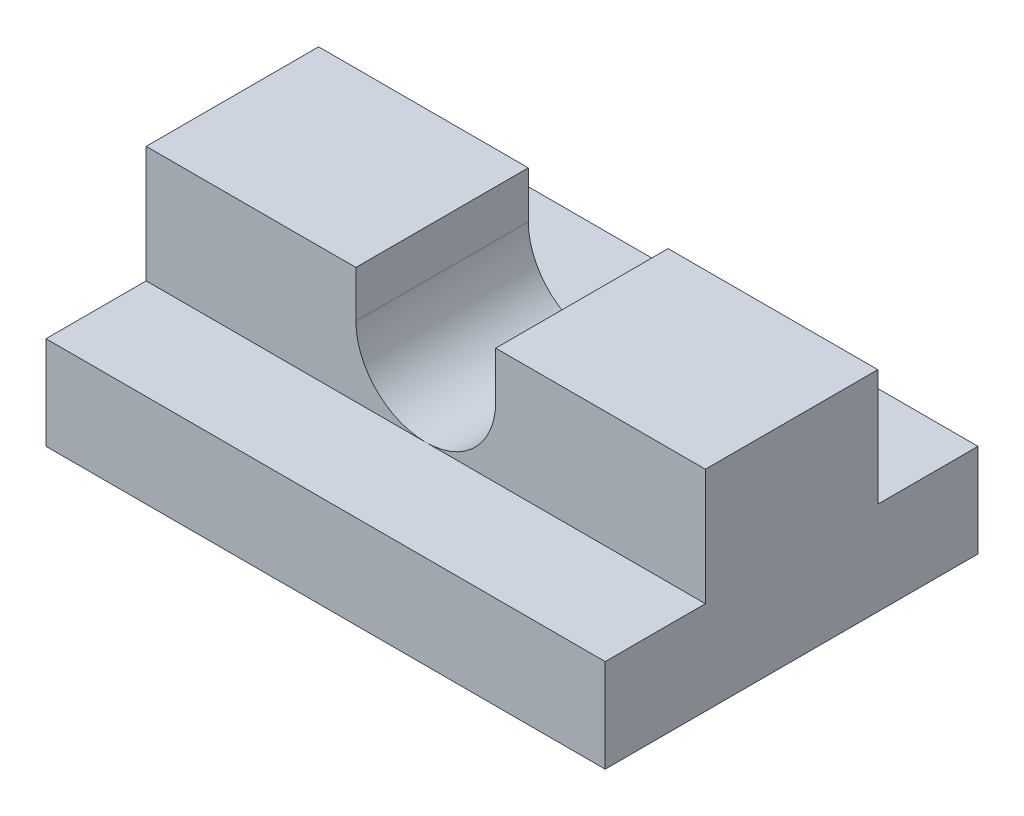
ISO-10303-21;
HEADER;
FILE_DESCRIPTION(('STEP AP214'),'2;1');
FILE_NAME('part.step','',(''),(''),'','','');
FILE_SCHEMA(('AUTOMOTIVE_DESIGN { 1 0 10303 214 1 1 1 1 }'));
ENDSEC;
DATA;
#1=APPLICATION_CONTEXT('core data for automotive mechanical design processes');
#2=APPLICATION_PROTOCOL_DEFINITION('international standard','automotive_design',2000,#1);
#3=PRODUCT_CONTEXT('',#1,'mechanical');
#4=PRODUCT('Part','Part','',(#3));
#5=PRODUCT_RELATED_PRODUCT_CATEGORY('part','',(#4));
#6=PRODUCT_DEFINITION_FORMATION('','',#4);
#7=PRODUCT_DEFINITION_CONTEXT('part definition',#1,'design');
#8=PRODUCT_DEFINITION('design','',#6,#7);
#9=PRODUCT_DEFINITION_SHAPE('','',#8);
#10=(LENGTH_UNIT() NAMED_UNIT(*) SI_UNIT(.MILLI.,.METRE.));
#11=(NAMED_UNIT(*) PLANE_ANGLE_UNIT() SI_UNIT($,.RADIAN.));
#12=(NAMED_UNIT(*) SI_UNIT($,.STERADIAN.) SOLID_ANGLE_UNIT());
#13=UNCERTAINTY_MEASURE_WITH_UNIT(LENGTH_MEASURE(1.E-05),#10,'distance_accuracy_value','');
#14=(GEOMETRIC_REPRESENTATION_CONTEXT(3) GLOBAL_UNCERTAINTY_ASSIGNED_CONTEXT((#13)) GLOBAL_UNIT_ASSIGNED_CONTEXT((#10,
#11,#12)) REPRESENTATION_CONTEXT('',''));
#15=CARTESIAN_POINT('',(0.,0.,0.));
#16=DIRECTION('',(0.,0.,1.));
#17=DIRECTION('',(1.,0.,0.));
#18=AXIS2_PLACEMENT_3D('',#15,#16,#17);
#19=CARTESIAN_POINT('',(0.,4.5,1.85));
#20=DIRECTION('',(0.,0.,-1.));
#21=DIRECTION('',(-1.,0.,0.));
#22=AXIS2_PLACEMENT_3D('',#19,#20,#21);
#23=PLANE('',#22);
#24=CARTESIAN_POINT('',(6.,3.5,1.85));
#25=DIRECTION('',(0.,0.,1.));
#26=DIRECTION('',(1.,0.,0.));
#27=AXIS2_PLACEMENT_3D('',#24,#25,#26);
#28=CIRCLE('',#27,1.5);
#29=CARTESIAN_POINT('',(4.5,3.5,1.85));
#30=VERTEX_POINT('',#29);
#31=CARTESIAN_POINT('',(6.,2.,1.85));
#32=VERTEX_POINT('',#31);
#33=EDGE_CURVE('E141',#30,#32,#28,.T.);
#34=ORIENTED_EDGE('',*,*,#33,.F.);
#35=DIRECTION('',(0.,-1.,0.));
#36=VECTOR('',#35,1.);
#37=CARTESIAN_POINT('',(4.5,3.5,1.85));
#38=LINE('',#37,#36);
#39=CARTESIAN_POINT('',(4.5,4.5,1.85));
#40=VERTEX_POINT('',#39);
#41=EDGE_CURVE('E135',#40,#30,#38,.T.);
#42=ORIENTED_EDGE('',*,*,#41,.F.);
#43=DIRECTION('',(1.,0.,0.));
#44=VECTOR('',#43,1.);
#45=CARTESIAN_POINT('',(0.,4.5,1.85));
#46=LINE('',#45,#44);
#47=CARTESIAN_POINT('',(0.,4.5,1.85));
#48=VERTEX_POINT('',#47);
#49=EDGE_CURVE('E162',#48,#40,#46,.T.);
#50=ORIENTED_EDGE('',*,*,#49,.F.);
#51=DIRECTION('',(0.,-1.,0.));
#52=VECTOR('',#51,1.);
#53=CARTESIAN_POINT('',(0.,4.5,1.85));
#54=LINE('',#53,#52);
#55=CARTESIAN_POINT('',(0.,2.,1.85));
#56=VERTEX_POINT('',#55);
#57=EDGE_CURVE('E185',#48,#56,#54,.T.);
#58=ORIENTED_EDGE('',*,*,#57,.T.);
#59=DIRECTION('',(1.,0.,0.));
#60=VECTOR('',#59,1.);
#61=CARTESIAN_POINT('',(0.,2.,1.85));
#62=LINE('',#61,#60);
#63=EDGE_CURVE('E172',#56,#32,#62,.T.);
#64=ORIENTED_EDGE('',*,*,#63,.T.);
#65=EDGE_LOOP('',(#34,#42,#50,#58,#64));
#66=FACE_BOUND('',#65,.T.);
#67=ADVANCED_FACE('F33',(#66),#23,.F.);
#68=CARTESIAN_POINT('',(0.,4.5,-1.85));
#69=DIRECTION('',(0.,0.,1.));
#70=DIRECTION('',(1.,0.,0.));
#71=AXIS2_PLACEMENT_3D('',#68,#69,#70);
#72=PLANE('',#71);
#73=DIRECTION('',(-1.,0.,0.));
#74=VECTOR('',#73,1.);
#75=CARTESIAN_POINT('',(0.,4.5,-1.85));
#76=LINE('',#75,#74);
#77=CARTESIAN_POINT('',(4.5,4.5,-1.85));
#78=VERTEX_POINT('',#77);
#79=CARTESIAN_POINT('',(0.,4.5,-1.85));
#80=VERTEX_POINT('',#79);
#81=EDGE_CURVE('E167',#78,#80,#76,.T.);
#82=ORIENTED_EDGE('',*,*,#81,.F.);
#83=DIRECTION('',(0.,-1.,0.));
#84=VECTOR('',#83,1.);
#85=CARTESIAN_POINT('',(4.5,4.5,-1.85));
#86=LINE('',#85,#84);
#87=CARTESIAN_POINT('',(4.5,3.5,-1.85));
#88=VERTEX_POINT('',#87);
#89=EDGE_CURVE('E155',#78,#88,#86,.T.);
#90=ORIENTED_EDGE('',*,*,#89,.T.);
#91=CARTESIAN_POINT('',(6.,3.5,-1.85));
#92=DIRECTION('',(0.,0.,1.));
#93=DIRECTION('',(1.,0.,0.));
#94=AXIS2_PLACEMENT_3D('',#91,#92,#93);
#95=CIRCLE('',#94,1.5);
#96=CARTESIAN_POINT('',(6.,2.,-1.85));
#97=VERTEX_POINT('',#96);
#98=EDGE_CURVE('E11',#88,#97,#95,.T.);
#99=ORIENTED_EDGE('',*,*,#98,.T.);
#100=DIRECTION('',(-1.,0.,0.));
#101=VECTOR('',#100,1.);
#102=CARTESIAN_POINT('',(0.,2.,-1.85));
#103=LINE('',#102,#101);
#104=CARTESIAN_POINT('',(0.,2.,-1.85));
#105=VERTEX_POINT('',#104);
#106=EDGE_CURVE('E175',#97,#105,#103,.T.);
#107=ORIENTED_EDGE('',*,*,#106,.T.);
#108=DIRECTION('',(0.,-1.,0.));
#109=VECTOR('',#108,1.);
#110=CARTESIAN_POINT('',(0.,4.5,-1.85));
#111=LINE('',#110,#109);
#112=EDGE_CURVE('E171',#80,#105,#111,.T.);
#113=ORIENTED_EDGE('',*,*,#112,.F.);
#114=EDGE_LOOP('',(#82,#90,#99,#107,#113));
#115=FACE_BOUND('',#114,.T.);
#116=ADVANCED_FACE('F231',(#115),#72,.F.);
#117=CARTESIAN_POINT('',(0.,4.5,0.));
#118=DIRECTION('',(0.,-1.,0.));
#119=DIRECTION('',(0.,0.,-1.));
#120=AXIS2_PLACEMENT_3D('',#117,#118,#119);
#121=PLANE('',#120);
#122=ORIENTED_EDGE('',*,*,#49,.T.);
#123=DIRECTION('',(0.,0.,-1.));
#124=VECTOR('',#123,1.);
#125=CARTESIAN_POINT('',(4.5,4.5,0.));
#126=LINE('',#125,#124);
#127=EDGE_CURVE('E222',#40,#78,#126,.T.);
#128=ORIENTED_EDGE('',*,*,#127,.T.);
#129=ORIENTED_EDGE('',*,*,#81,.T.);
#130=DIRECTION('',(0.,0.,1.));
#131=VECTOR('',#130,1.);
#132=CARTESIAN_POINT('',(0.,4.5,1.85));
#133=LINE('',#132,#131);
#134=EDGE_CURVE('E159',#80,#48,#133,.T.);
#135=ORIENTED_EDGE('',*,*,#134,.T.);
#136=EDGE_LOOP('',(#122,#128,#129,#135));
#137=FACE_BOUND('',#136,.T.);
#138=ADVANCED_FACE('F240',(#137),#121,.F.);
#139=CARTESIAN_POINT('',(0.,2.,0.));
#140=DIRECTION('',(0.,-1.,0.));
#141=DIRECTION('',(0.,0.,-1.));
#142=AXIS2_PLACEMENT_3D('',#139,#140,#141);
#143=PLANE('',#142);
#144=DIRECTION('',(-1.,0.,0.));
#145=VECTOR('',#144,1.);
#146=CARTESIAN_POINT('',(0.,2.,-3.99999999999999));
#147=LINE('',#146,#145);
#148=CARTESIAN_POINT('',(12.,2.,-4.));
#149=VERTEX_POINT('',#148);
#150=CARTESIAN_POINT('',(0.,2.,-3.99999999999999));
#151=VERTEX_POINT('',#150);
#152=EDGE_CURVE('E199',#149,#151,#147,.T.);
#153=ORIENTED_EDGE('',*,*,#152,.T.);
#154=DIRECTION('',(0.,0.,1.));
#155=VECTOR('',#154,1.);
#156=CARTESIAN_POINT('',(0.,2.,4.00000000000001));
#157=LINE('',#156,#155);
#158=EDGE_CURVE('E189',#151,#105,#157,.T.);
#159=ORIENTED_EDGE('',*,*,#158,.T.);
#160=ORIENTED_EDGE('',*,*,#106,.F.);
#161=CARTESIAN_POINT('',(12.,2.,-1.85));
#162=VERTEX_POINT('',#161);
#163=EDGE_CURVE('E56',#162,#97,#103,.T.);
#164=ORIENTED_EDGE('',*,*,#163,.F.);
#165=DIRECTION('',(0.,0.,-1.));
#166=VECTOR('',#165,1.);
#167=CARTESIAN_POINT('',(12.,2.,4.00000000000001));
#168=LINE('',#167,#166);
#169=EDGE_CURVE('E195',#162,#149,#168,.T.);
#170=ORIENTED_EDGE('',*,*,#169,.T.);
#171=EDGE_LOOP('',(#153,#159,#160,#164,#170));
#172=FACE_BOUND('',#171,.T.);
#173=ADVANCED_FACE('F233',(#172),#143,.F.);
#174=ORIENTED_EDGE('',*,*,#63,.F.);
#175=CARTESIAN_POINT('',(0.,2.,4.00000000000001));
#176=VERTEX_POINT('',#175);
#177=EDGE_CURVE('E193',#56,#176,#157,.T.);
#178=ORIENTED_EDGE('',*,*,#177,.T.);
#179=DIRECTION('',(1.,0.,0.));
#180=VECTOR('',#179,1.);
#181=CARTESIAN_POINT('',(0.,2.,4.00000000000001));
#182=LINE('',#181,#180);
#183=CARTESIAN_POINT('',(12.,2.,4.00000000000001));
#184=VERTEX_POINT('',#183);
#185=EDGE_CURVE('E192',#176,#184,#182,.T.);
#186=ORIENTED_EDGE('',*,*,#185,.T.);
#187=CARTESIAN_POINT('',(12.,2.,1.85));
#188=VERTEX_POINT('',#187);
#189=EDGE_CURVE('E196',#184,#188,#168,.T.);
#190=ORIENTED_EDGE('',*,*,#189,.T.);
#191=EDGE_CURVE('E158',#32,#188,#62,.T.);
#192=ORIENTED_EDGE('',*,*,#191,.F.);
#193=EDGE_LOOP('',(#174,#178,#186,#190,#192));
#194=FACE_BOUND('',#193,.T.);
#195=ADVANCED_FACE('F288',(#194),#143,.F.);
#196=CARTESIAN_POINT('',(0.,2.,4.00000000000001));
#197=DIRECTION('',(1.,0.,0.));
#198=DIRECTION('',(0.,0.,-1.));
#199=AXIS2_PLACEMENT_3D('',#196,#197,#198);
#200=PLANE('',#199);
#201=DIRECTION('',(0.,0.,1.));
#202=VECTOR('',#201,1.);
#203=CARTESIAN_POINT('',(0.,0.,4.00000000000001));
#204=LINE('',#203,#202);
#205=CARTESIAN_POINT('',(0.,0.,-3.99999999999999));
#206=VERTEX_POINT('',#205);
#207=CARTESIAN_POINT('',(0.,0.,4.00000000000001));
#208=VERTEX_POINT('',#207);
#209=EDGE_CURVE('E188',#206,#208,#204,.T.);
#210=ORIENTED_EDGE('',*,*,#209,.T.);
#211=DIRECTION('',(0.,-1.,0.));
#212=VECTOR('',#211,1.);
#213=CARTESIAN_POINT('',(0.,2.,4.00000000000001));
#214=LINE('',#213,#212);
#215=EDGE_CURVE('E218',#176,#208,#214,.T.);
#216=ORIENTED_EDGE('',*,*,#215,.F.);
#217=ORIENTED_EDGE('',*,*,#177,.F.);
#218=ORIENTED_EDGE('',*,*,#57,.F.);
#219=ORIENTED_EDGE('',*,*,#134,.F.);
#220=ORIENTED_EDGE('',*,*,#112,.T.);
#221=ORIENTED_EDGE('',*,*,#158,.F.);
#222=DIRECTION('',(0.,-1.,0.));
#223=VECTOR('',#222,1.);
#224=CARTESIAN_POINT('',(0.,2.,-3.99999999999999));
#225=LINE('',#224,#223);
#226=EDGE_CURVE('E201',#151,#206,#225,.T.);
#227=ORIENTED_EDGE('',*,*,#226,.T.);
#228=EDGE_LOOP('',(#210,#216,#217,#218,#219,#220,#221,#227));
#229=FACE_BOUND('',#228,.T.);
#230=ADVANCED_FACE('F35',(#229),#200,.F.);
#231=CARTESIAN_POINT('',(0.,2.,4.00000000000001));
#232=DIRECTION('',(0.,0.,-1.));
#233=DIRECTION('',(-1.,0.,0.));
#234=AXIS2_PLACEMENT_3D('',#231,#232,#233);
#235=PLANE('',#234);
#236=DIRECTION('',(1.,0.,0.));
#237=VECTOR('',#236,1.);
#238=CARTESIAN_POINT('',(0.,0.,4.00000000000001));
#239=LINE('',#238,#237);
#240=CARTESIAN_POINT('',(12.,0.,4.00000000000001));
#241=VERTEX_POINT('',#240);
#242=EDGE_CURVE('E204',#208,#241,#239,.T.);
#243=ORIENTED_EDGE('',*,*,#242,.T.);
#244=DIRECTION('',(0.,-1.,0.));
#245=VECTOR('',#244,1.);
#246=CARTESIAN_POINT('',(12.,2.,4.00000000000001));
#247=LINE('',#246,#245);
#248=EDGE_CURVE('E215',#184,#241,#247,.T.);
#249=ORIENTED_EDGE('',*,*,#248,.F.);
#250=ORIENTED_EDGE('',*,*,#185,.F.);
#251=ORIENTED_EDGE('',*,*,#215,.T.);
#252=EDGE_LOOP('',(#243,#249,#250,#251));
#253=FACE_BOUND('',#252,.T.);
#254=ADVANCED_FACE('F281',(#253),#235,.F.);
#255=CARTESIAN_POINT('',(12.,2.,4.00000000000001));
#256=DIRECTION('',(-1.,0.,0.));
#257=DIRECTION('',(0.,0.,1.));
#258=AXIS2_PLACEMENT_3D('',#255,#256,#257);
#259=PLANE('',#258);
#260=DIRECTION('',(0.,0.,-1.));
#261=VECTOR('',#260,1.);
#262=CARTESIAN_POINT('',(12.,0.,4.00000000000001));
#263=LINE('',#262,#261);
#264=CARTESIAN_POINT('',(12.,0.,-4.));
#265=VERTEX_POINT('',#264);
#266=EDGE_CURVE('E206',#241,#265,#263,.T.);
#267=ORIENTED_EDGE('',*,*,#266,.T.);
#268=DIRECTION('',(0.,-1.,0.));
#269=VECTOR('',#268,1.);
#270=CARTESIAN_POINT('',(12.,2.,-4.));
#271=LINE('',#270,#269);
#272=EDGE_CURVE('E212',#149,#265,#271,.T.);
#273=ORIENTED_EDGE('',*,*,#272,.F.);
#274=ORIENTED_EDGE('',*,*,#169,.F.);
#275=DIRECTION('',(0.,-1.,0.));
#276=VECTOR('',#275,1.);
#277=CARTESIAN_POINT('',(12.,4.5,-1.85));
#278=LINE('',#277,#276);
#279=CARTESIAN_POINT('',(12.,4.5,-1.85));
#280=VERTEX_POINT('',#279);
#281=EDGE_CURVE('E179',#280,#162,#278,.T.);
#282=ORIENTED_EDGE('',*,*,#281,.F.);
#283=DIRECTION('',(0.,0.,-1.));
#284=VECTOR('',#283,1.);
#285=CARTESIAN_POINT('',(12.,4.5,1.85));
#286=LINE('',#285,#284);
#287=CARTESIAN_POINT('',(12.,4.5,1.85));
#288=VERTEX_POINT('',#287);
#289=EDGE_CURVE('E165',#288,#280,#286,.T.);
#290=ORIENTED_EDGE('',*,*,#289,.F.);
#291=DIRECTION('',(0.,-1.,0.));
#292=VECTOR('',#291,1.);
#293=CARTESIAN_POINT('',(12.,4.5,1.85));
#294=LINE('',#293,#292);
#295=EDGE_CURVE('E182',#288,#188,#294,.T.);
#296=ORIENTED_EDGE('',*,*,#295,.T.);
#297=ORIENTED_EDGE('',*,*,#189,.F.);
#298=ORIENTED_EDGE('',*,*,#248,.T.);
#299=EDGE_LOOP('',(#267,#273,#274,#282,#290,#296,#297,#298));
#300=FACE_BOUND('',#299,.T.);
#301=ADVANCED_FACE('F275',(#300),#259,.F.);
#302=CARTESIAN_POINT('',(0.,2.,-3.99999999999999));
#303=DIRECTION('',(0.,0.,1.));
#304=DIRECTION('',(1.,0.,0.));
#305=AXIS2_PLACEMENT_3D('',#302,#303,#304);
#306=PLANE('',#305);
#307=DIRECTION('',(-1.,0.,0.));
#308=VECTOR('',#307,1.);
#309=CARTESIAN_POINT('',(0.,0.,-3.99999999999999));
#310=LINE('',#309,#308);
#311=EDGE_CURVE('E208',#265,#206,#310,.T.);
#312=ORIENTED_EDGE('',*,*,#311,.T.);
#313=ORIENTED_EDGE('',*,*,#226,.F.);
#314=ORIENTED_EDGE('',*,*,#152,.F.);
#315=ORIENTED_EDGE('',*,*,#272,.T.);
#316=EDGE_LOOP('',(#312,#313,#314,#315));
#317=FACE_BOUND('',#316,.T.);
#318=ADVANCED_FACE('F269',(#317),#306,.F.);
#319=CARTESIAN_POINT('',(0.,0.,0.));
#320=DIRECTION('',(0.,-1.,0.));
#321=DIRECTION('',(0.,0.,-1.));
#322=AXIS2_PLACEMENT_3D('',#319,#320,#321);
#323=PLANE('',#322);
#324=ORIENTED_EDGE('',*,*,#209,.F.);
#325=ORIENTED_EDGE('',*,*,#311,.F.);
#326=ORIENTED_EDGE('',*,*,#266,.F.);
#327=ORIENTED_EDGE('',*,*,#242,.F.);
#328=EDGE_LOOP('',(#324,#325,#326,#327));
#329=FACE_BOUND('',#328,.T.);
#330=ADVANCED_FACE('F264',(#329),#323,.T.);
#331=DIRECTION('',(0.,1.,0.));
#332=VECTOR('',#331,1.);
#333=CARTESIAN_POINT('',(7.5,5.,1.85));
#334=LINE('',#333,#332);
#335=CARTESIAN_POINT('',(7.5,3.5,1.85));
#336=VERTEX_POINT('',#335);
#337=CARTESIAN_POINT('',(7.5,4.5,1.85));
#338=VERTEX_POINT('',#337);
#339=EDGE_CURVE('E48',#336,#338,#334,.T.);
#340=ORIENTED_EDGE('',*,*,#339,.F.);
#341=EDGE_CURVE('E138',#32,#336,#28,.T.);
#342=ORIENTED_EDGE('',*,*,#341,.F.);
#343=ORIENTED_EDGE('',*,*,#191,.T.);
#344=ORIENTED_EDGE('',*,*,#295,.F.);
#345=EDGE_CURVE('E148',#338,#288,#46,.T.);
#346=ORIENTED_EDGE('',*,*,#345,.F.);
#347=EDGE_LOOP('',(#340,#342,#343,#344,#346));
#348=FACE_BOUND('',#347,.T.);
#349=ADVANCED_FACE('F146',(#348),#23,.F.);
#350=ORIENTED_EDGE('',*,*,#163,.T.);
#351=CARTESIAN_POINT('',(7.5,3.5,-1.85));
#352=VERTEX_POINT('',#351);
#353=EDGE_CURVE('E37',#97,#352,#95,.T.);
#354=ORIENTED_EDGE('',*,*,#353,.T.);
#355=DIRECTION('',(0.,1.,0.));
#356=VECTOR('',#355,1.);
#357=CARTESIAN_POINT('',(7.5,4.5,-1.85));
#358=LINE('',#357,#356);
#359=CARTESIAN_POINT('',(7.5,4.5,-1.85));
#360=VERTEX_POINT('',#359);
#361=EDGE_CURVE('E131',#352,#360,#358,.T.);
#362=ORIENTED_EDGE('',*,*,#361,.T.);
#363=EDGE_CURVE('E168',#280,#360,#76,.T.);
#364=ORIENTED_EDGE('',*,*,#363,.F.);
#365=ORIENTED_EDGE('',*,*,#281,.T.);
#366=EDGE_LOOP('',(#350,#354,#362,#364,#365));
#367=FACE_BOUND('',#366,.T.);
#368=ADVANCED_FACE('F227',(#367),#72,.F.);
#369=ORIENTED_EDGE('',*,*,#363,.T.);
#370=DIRECTION('',(0.,0.,1.));
#371=VECTOR('',#370,1.);
#372=CARTESIAN_POINT('',(7.5,4.5,0.));
#373=LINE('',#372,#371);
#374=EDGE_CURVE('E221',#360,#338,#373,.T.);
#375=ORIENTED_EDGE('',*,*,#374,.T.);
#376=ORIENTED_EDGE('',*,*,#345,.T.);
#377=ORIENTED_EDGE('',*,*,#289,.T.);
#378=EDGE_LOOP('',(#369,#375,#376,#377));
#379=FACE_BOUND('',#378,.T.);
#380=ADVANCED_FACE('F254',(#379),#121,.F.);
#381=CARTESIAN_POINT('',(6.,3.5,-4.));
#382=DIRECTION('',(0.,0.,1.));
#383=DIRECTION('',(1.,0.,0.));
#384=AXIS2_PLACEMENT_3D('',#381,#382,#383);
#385=CYLINDRICAL_SURFACE('',#384,1.5);
#386=DIRECTION('',(0.,0.,1.));
#387=VECTOR('',#386,1.);
#388=CARTESIAN_POINT('',(4.5,3.5,-4.));
#389=LINE('',#388,#387);
#390=EDGE_CURVE('E134',#88,#30,#389,.T.);
#391=ORIENTED_EDGE('',*,*,#390,.T.);
#392=ORIENTED_EDGE('',*,*,#33,.T.);
#393=ORIENTED_EDGE('',*,*,#341,.T.);
#394=DIRECTION('',(0.,0.,1.));
#395=VECTOR('',#394,1.);
#396=CARTESIAN_POINT('',(7.5,3.5,-4.));
#397=LINE('',#396,#395);
#398=EDGE_CURVE('E127',#352,#336,#397,.T.);
#399=ORIENTED_EDGE('',*,*,#398,.F.);
#400=ORIENTED_EDGE('',*,*,#353,.F.);
#401=ORIENTED_EDGE('',*,*,#98,.F.);
#402=EDGE_LOOP('',(#391,#392,#393,#399,#400,#401));
#403=FACE_BOUND('',#402,.T.);
#404=ADVANCED_FACE('F139',(#403),#385,.F.);
#405=CARTESIAN_POINT('',(4.5,3.5,-4.));
#406=DIRECTION('',(-1.,0.,0.));
#407=DIRECTION('',(0.,0.,1.));
#408=AXIS2_PLACEMENT_3D('',#405,#406,#407);
#409=PLANE('',#408);
#410=ORIENTED_EDGE('',*,*,#127,.F.);
#411=ORIENTED_EDGE('',*,*,#41,.T.);
#412=ORIENTED_EDGE('',*,*,#390,.F.);
#413=ORIENTED_EDGE('',*,*,#89,.F.);
#414=EDGE_LOOP('',(#410,#411,#412,#413));
#415=FACE_BOUND('',#414,.T.);
#416=ADVANCED_FACE('F246',(#415),#409,.F.);
#417=CARTESIAN_POINT('',(7.5,5.,-4.));
#418=DIRECTION('',(1.,0.,0.));
#419=DIRECTION('',(0.,0.,-1.));
#420=AXIS2_PLACEMENT_3D('',#417,#418,#419);
#421=PLANE('',#420);
#422=ORIENTED_EDGE('',*,*,#398,.T.);
#423=ORIENTED_EDGE('',*,*,#339,.T.);
#424=ORIENTED_EDGE('',*,*,#374,.F.);
#425=ORIENTED_EDGE('',*,*,#361,.F.);
#426=EDGE_LOOP('',(#422,#423,#424,#425));
#427=FACE_BOUND('',#426,.T.);
#428=ADVANCED_FACE('F129',(#427),#421,.F.);
#429=CLOSED_SHELL('',(#67,#116,#138,#173,#195,#230,#254,#301,#318,#330,#349,#368,#380,#404,#416,#428));
#430=MANIFOLD_SOLID_BREP('B2',#429);
#431=ADVANCED_BREP_SHAPE_REPRESENTATION('',(#18,#430),#14);
#432=SHAPE_DEFINITION_REPRESENTATION(#9,#431);
ENDSEC;
END-ISO-10303-21;
